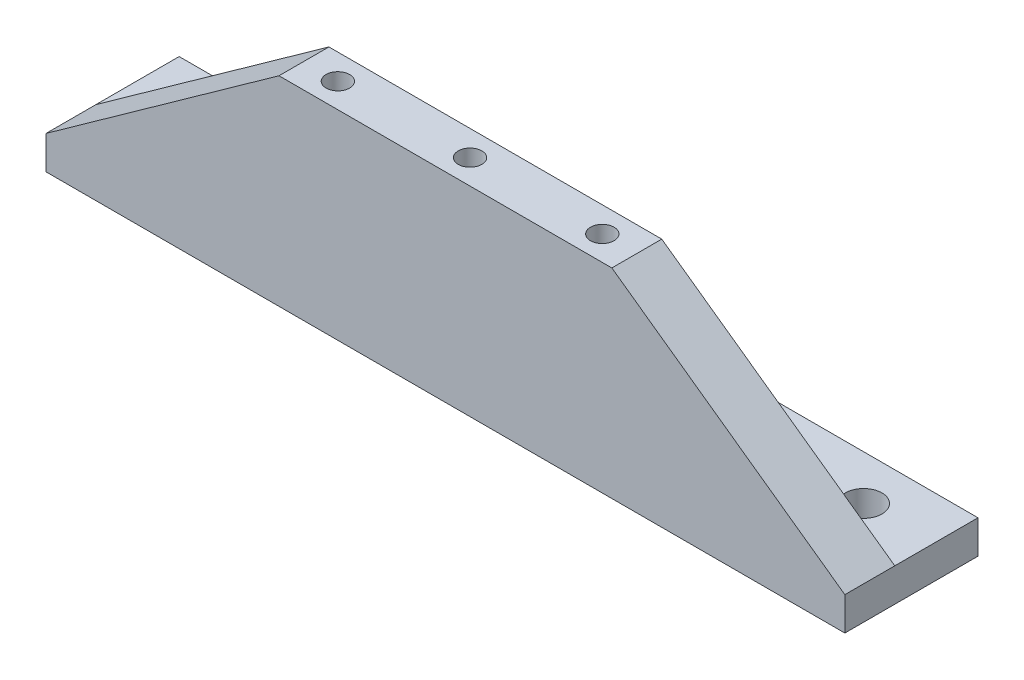
ISO-10303-21;
HEADER;
FILE_DESCRIPTION(('STEP AP214'),'2;1');
FILE_NAME('part.step','',(''),(''),'','','');
FILE_SCHEMA(('AUTOMOTIVE_DESIGN { 1 0 10303 214 1 1 1 1 }'));
ENDSEC;
DATA;
#1=APPLICATION_CONTEXT('core data for automotive mechanical design processes');
#2=APPLICATION_PROTOCOL_DEFINITION('international standard','automotive_design',2000,#1);
#3=PRODUCT_CONTEXT('',#1,'mechanical');
#4=PRODUCT('Part','Part','',(#3));
#5=PRODUCT_RELATED_PRODUCT_CATEGORY('part','',(#4));
#6=PRODUCT_DEFINITION_FORMATION('','',#4);
#7=PRODUCT_DEFINITION_CONTEXT('part definition',#1,'design');
#8=PRODUCT_DEFINITION('design','',#6,#7);
#9=PRODUCT_DEFINITION_SHAPE('','',#8);
#10=(LENGTH_UNIT() NAMED_UNIT(*) SI_UNIT(.MILLI.,.METRE.));
#11=(NAMED_UNIT(*) PLANE_ANGLE_UNIT() SI_UNIT($,.RADIAN.));
#12=(NAMED_UNIT(*) SI_UNIT($,.STERADIAN.) SOLID_ANGLE_UNIT());
#13=UNCERTAINTY_MEASURE_WITH_UNIT(LENGTH_MEASURE(1.E-05),#10,'distance_accuracy_value','');
#14=(GEOMETRIC_REPRESENTATION_CONTEXT(3) GLOBAL_UNCERTAINTY_ASSIGNED_CONTEXT((#13)) GLOBAL_UNIT_ASSIGNED_CONTEXT((#10,
#11,#12)) REPRESENTATION_CONTEXT('',''));
#15=CARTESIAN_POINT('',(0.,0.,0.));
#16=DIRECTION('',(0.,0.,1.));
#17=DIRECTION('',(1.,0.,0.));
#18=AXIS2_PLACEMENT_3D('',#15,#16,#17);
#19=CARTESIAN_POINT('',(0.,38.1,0.));
#20=DIRECTION('',(1.,0.,0.));
#21=DIRECTION('',(0.,0.,-1.));
#22=AXIS2_PLACEMENT_3D('',#19,#20,#21);
#23=PLANE('',#22);
#24=DIRECTION('',(0.,-1.,0.));
#25=VECTOR('',#24,1.);
#26=CARTESIAN_POINT('',(0.,38.1,0.));
#27=LINE('',#26,#25);
#28=CARTESIAN_POINT('',(0.,6.35,0.));
#29=VERTEX_POINT('',#28);
#30=CARTESIAN_POINT('',(0.,0.,0.));
#31=VERTEX_POINT('',#30);
#32=EDGE_CURVE('E24',#29,#31,#27,.T.);
#33=ORIENTED_EDGE('',*,*,#32,.F.);
#34=DIRECTION('',(0.,0.,1.));
#35=VECTOR('',#34,1.);
#36=CARTESIAN_POINT('',(0.,6.35,-25.4));
#37=LINE('',#36,#35);
#38=CARTESIAN_POINT('',(0.,6.35,-9.525));
#39=VERTEX_POINT('',#38);
#40=EDGE_CURVE('E92',#39,#29,#37,.T.);
#41=ORIENTED_EDGE('',*,*,#40,.F.);
#42=CARTESIAN_POINT('',(0.,6.35,-25.4));
#43=VERTEX_POINT('',#42);
#44=EDGE_CURVE('E88',#43,#39,#37,.T.);
#45=ORIENTED_EDGE('',*,*,#44,.F.);
#46=DIRECTION('',(0.,-1.,0.));
#47=VECTOR('',#46,1.);
#48=CARTESIAN_POINT('',(0.,38.1,-25.4));
#49=LINE('',#48,#47);
#50=CARTESIAN_POINT('',(0.,0.,-25.4));
#51=VERTEX_POINT('',#50);
#52=EDGE_CURVE('E39',#43,#51,#49,.T.);
#53=ORIENTED_EDGE('',*,*,#52,.T.);
#54=DIRECTION('',(0.,0.,1.));
#55=VECTOR('',#54,1.);
#56=CARTESIAN_POINT('',(0.,0.,0.));
#57=LINE('',#56,#55);
#58=EDGE_CURVE('E114',#51,#31,#57,.T.);
#59=ORIENTED_EDGE('',*,*,#58,.T.);
#60=EDGE_LOOP('',(#33,#41,#45,#53,#59));
#61=FACE_BOUND('',#60,.T.);
#62=ADVANCED_FACE('F17',(#61),#23,.F.);
#63=CARTESIAN_POINT('',(0.,38.1,0.));
#64=DIRECTION('',(0.,0.,-1.));
#65=DIRECTION('',(-1.,0.,0.));
#66=AXIS2_PLACEMENT_3D('',#63,#64,#65);
#67=PLANE('',#66);
#68=DIRECTION('',(1.,0.,0.));
#69=VECTOR('',#68,1.);
#70=CARTESIAN_POINT('',(0.,38.1,0.));
#71=LINE('',#70,#69);
#72=CARTESIAN_POINT('',(44.45,38.1,0.));
#73=VERTEX_POINT('',#72);
#74=CARTESIAN_POINT('',(107.95,38.1,0.));
#75=VERTEX_POINT('',#74);
#76=EDGE_CURVE('E111',#73,#75,#71,.T.);
#77=ORIENTED_EDGE('',*,*,#76,.F.);
#78=DIRECTION('',(0.813733471206735,0.581238193719097,0.));
#79=VECTOR('',#78,1.);
#80=CARTESIAN_POINT('',(-3.00337837837838,4.20472972972973,0.));
#81=LINE('',#80,#79);
#82=EDGE_CURVE('E98',#29,#73,#81,.T.);
#83=ORIENTED_EDGE('',*,*,#82,.F.);
#84=ORIENTED_EDGE('',*,*,#32,.T.);
#85=DIRECTION('',(1.,0.,0.));
#86=VECTOR('',#85,1.);
#87=CARTESIAN_POINT('',(0.,0.,0.));
#88=LINE('',#87,#86);
#89=CARTESIAN_POINT('',(152.4,0.,0.));
#90=VERTEX_POINT('',#89);
#91=EDGE_CURVE('E116',#31,#90,#88,.T.);
#92=ORIENTED_EDGE('',*,*,#91,.T.);
#93=DIRECTION('',(0.,-1.,0.));
#94=VECTOR('',#93,1.);
#95=CARTESIAN_POINT('',(152.4,38.1,0.));
#96=LINE('',#95,#94);
#97=CARTESIAN_POINT('',(152.4,6.35,0.));
#98=VERTEX_POINT('',#97);
#99=EDGE_CURVE('E126',#98,#90,#96,.T.);
#100=ORIENTED_EDGE('',*,*,#99,.F.);
#101=DIRECTION('',(0.813733471206735,-0.581238193719096,0.));
#102=VECTOR('',#101,1.);
#103=CARTESIAN_POINT('',(54.4898648648649,76.2858108108108,0.));
#104=LINE('',#103,#102);
#105=EDGE_CURVE('E103',#75,#98,#104,.T.);
#106=ORIENTED_EDGE('',*,*,#105,.F.);
#107=EDGE_LOOP('',(#77,#83,#84,#92,#100,#106));
#108=FACE_BOUND('',#107,.T.);
#109=ADVANCED_FACE('F130',(#108),#67,.F.);
#110=CARTESIAN_POINT('',(152.4,38.1,0.));
#111=DIRECTION('',(-1.,0.,0.));
#112=DIRECTION('',(0.,0.,1.));
#113=AXIS2_PLACEMENT_3D('',#110,#111,#112);
#114=PLANE('',#113);
#115=DIRECTION('',(0.,-1.,0.));
#116=VECTOR('',#115,1.);
#117=CARTESIAN_POINT('',(152.4,38.1,-25.4));
#118=LINE('',#117,#116);
#119=CARTESIAN_POINT('',(152.4,6.35,-25.4));
#120=VERTEX_POINT('',#119);
#121=CARTESIAN_POINT('',(152.4,0.,-25.4));
#122=VERTEX_POINT('',#121);
#123=EDGE_CURVE('E124',#120,#122,#118,.T.);
#124=ORIENTED_EDGE('',*,*,#123,.F.);
#125=DIRECTION('',(0.,0.,1.));
#126=VECTOR('',#125,1.);
#127=CARTESIAN_POINT('',(152.4,6.35,-25.4));
#128=LINE('',#127,#126);
#129=CARTESIAN_POINT('',(152.4,6.35,-9.525));
#130=VERTEX_POINT('',#129);
#131=EDGE_CURVE('E99',#120,#130,#128,.T.);
#132=ORIENTED_EDGE('',*,*,#131,.T.);
#133=EDGE_CURVE('E109',#130,#98,#128,.T.);
#134=ORIENTED_EDGE('',*,*,#133,.T.);
#135=ORIENTED_EDGE('',*,*,#99,.T.);
#136=DIRECTION('',(0.,0.,-1.));
#137=VECTOR('',#136,1.);
#138=CARTESIAN_POINT('',(152.4,0.,0.));
#139=LINE('',#138,#137);
#140=EDGE_CURVE('E119',#90,#122,#139,.T.);
#141=ORIENTED_EDGE('',*,*,#140,.T.);
#142=EDGE_LOOP('',(#124,#132,#134,#135,#141));
#143=FACE_BOUND('',#142,.T.);
#144=ADVANCED_FACE('F139',(#143),#114,.F.);
#145=CARTESIAN_POINT('',(0.,38.1,-25.4));
#146=DIRECTION('',(0.,0.,1.));
#147=DIRECTION('',(1.,0.,0.));
#148=AXIS2_PLACEMENT_3D('',#145,#146,#147);
#149=PLANE('',#148);
#150=ORIENTED_EDGE('',*,*,#52,.F.);
#151=DIRECTION('',(1.,0.,0.));
#152=VECTOR('',#151,1.);
#153=CARTESIAN_POINT('',(0.,6.35,-25.4));
#154=LINE('',#153,#152);
#155=EDGE_CURVE('E85',#43,#120,#154,.T.);
#156=ORIENTED_EDGE('',*,*,#155,.T.);
#157=ORIENTED_EDGE('',*,*,#123,.T.);
#158=DIRECTION('',(-1.,0.,0.));
#159=VECTOR('',#158,1.);
#160=CARTESIAN_POINT('',(0.,0.,-25.4));
#161=LINE('',#160,#159);
#162=EDGE_CURVE('E113',#122,#51,#161,.T.);
#163=ORIENTED_EDGE('',*,*,#162,.T.);
#164=EDGE_LOOP('',(#150,#156,#157,#163));
#165=FACE_BOUND('',#164,.T.);
#166=ADVANCED_FACE('F270',(#165),#149,.F.);
#167=CARTESIAN_POINT('',(0.,38.1,0.));
#168=DIRECTION('',(0.,-1.,0.));
#169=DIRECTION('',(0.,0.,-1.));
#170=AXIS2_PLACEMENT_3D('',#167,#168,#169);
#171=PLANE('',#170);
#172=CARTESIAN_POINT('',(101.4222,38.1,-4.699));
#173=DIRECTION('',(0.,-1.,0.));
#174=DIRECTION('',(0.,0.,-1.));
#175=AXIS2_PLACEMENT_3D('',#172,#173,#174);
#176=CIRCLE('',#175,2.2479);
#177=CARTESIAN_POINT('',(101.4222,38.1,-6.9469));
#178=VERTEX_POINT('',#177);
#179=EDGE_CURVE('E209',#178,#178,#176,.T.);
#180=ORIENTED_EDGE('',*,*,#179,.T.);
#181=EDGE_LOOP('',(#180));
#182=FACE_BOUND('',#181,.T.);
#183=CARTESIAN_POINT('',(76.2,38.1,-4.699));
#184=DIRECTION('',(0.,-1.,0.));
#185=DIRECTION('',(0.,0.,-1.));
#186=AXIS2_PLACEMENT_3D('',#183,#184,#185);
#187=CIRCLE('',#186,2.2479);
#188=CARTESIAN_POINT('',(76.2,38.1,-6.9469));
#189=VERTEX_POINT('',#188);
#190=EDGE_CURVE('E197',#189,#189,#187,.T.);
#191=ORIENTED_EDGE('',*,*,#190,.T.);
#192=EDGE_LOOP('',(#191));
#193=FACE_BOUND('',#192,.T.);
#194=CARTESIAN_POINT('',(50.9778,38.1,-4.699));
#195=DIRECTION('',(0.,-1.,0.));
#196=DIRECTION('',(0.,0.,-1.));
#197=AXIS2_PLACEMENT_3D('',#194,#195,#196);
#198=CIRCLE('',#197,2.2479);
#199=CARTESIAN_POINT('',(50.9778,38.1,-6.9469));
#200=VERTEX_POINT('',#199);
#201=EDGE_CURVE('E154',#200,#200,#198,.T.);
#202=ORIENTED_EDGE('',*,*,#201,.T.);
#203=EDGE_LOOP('',(#202));
#204=FACE_BOUND('',#203,.T.);
#205=DIRECTION('',(0.,0.,1.));
#206=VECTOR('',#205,1.);
#207=CARTESIAN_POINT('',(107.95,38.1,-25.4));
#208=LINE('',#207,#206);
#209=CARTESIAN_POINT('',(107.95,38.1,-9.525));
#210=VERTEX_POINT('',#209);
#211=EDGE_CURVE('E106',#210,#75,#208,.T.);
#212=ORIENTED_EDGE('',*,*,#211,.F.);
#213=DIRECTION('',(1.,0.,0.));
#214=VECTOR('',#213,1.);
#215=CARTESIAN_POINT('',(0.,38.1,-9.525));
#216=LINE('',#215,#214);
#217=CARTESIAN_POINT('',(44.45,38.1,-9.525));
#218=VERTEX_POINT('',#217);
#219=EDGE_CURVE('E86',#218,#210,#216,.T.);
#220=ORIENTED_EDGE('',*,*,#219,.F.);
#221=DIRECTION('',(0.,0.,1.));
#222=VECTOR('',#221,1.);
#223=CARTESIAN_POINT('',(44.45,38.1,-25.4));
#224=LINE('',#223,#222);
#225=EDGE_CURVE('E31',#218,#73,#224,.T.);
#226=ORIENTED_EDGE('',*,*,#225,.T.);
#227=ORIENTED_EDGE('',*,*,#76,.T.);
#228=EDGE_LOOP('',(#212,#220,#226,#227));
#229=FACE_BOUND('',#228,.T.);
#230=ADVANCED_FACE('F143',(#182,#193,#204,#229),#171,.F.);
#231=CARTESIAN_POINT('',(0.,0.,0.));
#232=DIRECTION('',(0.,-1.,0.));
#233=DIRECTION('',(0.,0.,-1.));
#234=AXIS2_PLACEMENT_3D('',#231,#232,#233);
#235=PLANE('',#234);
#236=CARTESIAN_POINT('',(101.4222,0.,-4.699));
#237=DIRECTION('',(0.,-1.,0.));
#238=DIRECTION('',(0.,0.,-1.));
#239=AXIS2_PLACEMENT_3D('',#236,#237,#238);
#240=CIRCLE('',#239,3.96875);
#241=CARTESIAN_POINT('',(101.4222,0.,-8.66775));
#242=VERTEX_POINT('',#241);
#243=EDGE_CURVE('E218',#242,#242,#240,.T.);
#244=ORIENTED_EDGE('',*,*,#243,.F.);
#245=EDGE_LOOP('',(#244));
#246=FACE_BOUND('',#245,.T.);
#247=CARTESIAN_POINT('',(76.2,0.,-4.699));
#248=DIRECTION('',(0.,-1.,0.));
#249=DIRECTION('',(0.,0.,-1.));
#250=AXIS2_PLACEMENT_3D('',#247,#248,#249);
#251=CIRCLE('',#250,3.96875);
#252=CARTESIAN_POINT('',(76.2,0.,-8.66775));
#253=VERTEX_POINT('',#252);
#254=EDGE_CURVE('E206',#253,#253,#251,.T.);
#255=ORIENTED_EDGE('',*,*,#254,.F.);
#256=EDGE_LOOP('',(#255));
#257=FACE_BOUND('',#256,.T.);
#258=CARTESIAN_POINT('',(50.9778,0.,-4.699));
#259=DIRECTION('',(0.,-1.,0.));
#260=DIRECTION('',(0.,0.,-1.));
#261=AXIS2_PLACEMENT_3D('',#258,#259,#260);
#262=CIRCLE('',#261,3.96875);
#263=CARTESIAN_POINT('',(50.9778,0.,-8.66775));
#264=VERTEX_POINT('',#263);
#265=EDGE_CURVE('E194',#264,#264,#262,.T.);
#266=ORIENTED_EDGE('',*,*,#265,.F.);
#267=EDGE_LOOP('',(#266));
#268=FACE_BOUND('',#267,.T.);
#269=CARTESIAN_POINT('',(13.2715,0.,-16.8589372808014));
#270=DIRECTION('',(0.,1.,0.));
#271=DIRECTION('',(0.,0.,1.));
#272=AXIS2_PLACEMENT_3D('',#269,#270,#271);
#273=CIRCLE('',#272,3.5433);
#274=CARTESIAN_POINT('',(13.2715,0.,-13.3156372808015));
#275=VERTEX_POINT('',#274);
#276=EDGE_CURVE('E148',#275,#275,#273,.T.);
#277=ORIENTED_EDGE('',*,*,#276,.T.);
#278=EDGE_LOOP('',(#277));
#279=FACE_BOUND('',#278,.T.);
#280=CARTESIAN_POINT('',(63.6905,0.,-16.8589372808009));
#281=DIRECTION('',(0.,1.,0.));
#282=DIRECTION('',(0.,0.,1.));
#283=AXIS2_PLACEMENT_3D('',#280,#281,#282);
#284=CIRCLE('',#283,3.4925);
#285=CARTESIAN_POINT('',(63.6905,0.,-13.3664372808009));
#286=VERTEX_POINT('',#285);
#287=EDGE_CURVE('E174',#286,#286,#284,.T.);
#288=ORIENTED_EDGE('',*,*,#287,.T.);
#289=EDGE_LOOP('',(#288));
#290=FACE_BOUND('',#289,.T.);
#291=CARTESIAN_POINT('',(139.1285,0.,-16.8589372808014));
#292=DIRECTION('',(0.,1.,0.));
#293=DIRECTION('',(0.,0.,1.));
#294=AXIS2_PLACEMENT_3D('',#291,#292,#293);
#295=CIRCLE('',#294,3.4925);
#296=CARTESIAN_POINT('',(139.1285,0.,-13.3664372808014));
#297=VERTEX_POINT('',#296);
#298=EDGE_CURVE('E162',#297,#297,#295,.T.);
#299=ORIENTED_EDGE('',*,*,#298,.T.);
#300=EDGE_LOOP('',(#299));
#301=FACE_BOUND('',#300,.T.);
#302=CARTESIAN_POINT('',(88.8365,0.,-16.8589372808011));
#303=DIRECTION('',(0.,1.,0.));
#304=DIRECTION('',(0.,0.,1.));
#305=AXIS2_PLACEMENT_3D('',#302,#303,#304);
#306=CIRCLE('',#305,3.4925);
#307=CARTESIAN_POINT('',(88.8365,0.,-13.3664372808011));
#308=VERTEX_POINT('',#307);
#309=EDGE_CURVE('E161',#308,#308,#306,.T.);
#310=ORIENTED_EDGE('',*,*,#309,.T.);
#311=EDGE_LOOP('',(#310));
#312=FACE_BOUND('',#311,.T.);
#313=CARTESIAN_POINT('',(113.9825,0.,-16.8589372808013));
#314=DIRECTION('',(0.,1.,0.));
#315=DIRECTION('',(0.,0.,1.));
#316=AXIS2_PLACEMENT_3D('',#313,#314,#315);
#317=CIRCLE('',#316,3.4925);
#318=CARTESIAN_POINT('',(113.9825,0.,-13.3664372808013));
#319=VERTEX_POINT('',#318);
#320=EDGE_CURVE('E168',#319,#319,#317,.T.);
#321=ORIENTED_EDGE('',*,*,#320,.T.);
#322=EDGE_LOOP('',(#321));
#323=FACE_BOUND('',#322,.T.);
#324=CARTESIAN_POINT('',(38.5445,0.,-16.8589372808007));
#325=DIRECTION('',(0.,1.,0.));
#326=DIRECTION('',(0.,0.,1.));
#327=AXIS2_PLACEMENT_3D('',#324,#325,#326);
#328=CIRCLE('',#327,3.4925);
#329=CARTESIAN_POINT('',(38.5445,0.,-13.3664372808007));
#330=VERTEX_POINT('',#329);
#331=EDGE_CURVE('E153',#330,#330,#328,.T.);
#332=ORIENTED_EDGE('',*,*,#331,.T.);
#333=EDGE_LOOP('',(#332));
#334=FACE_BOUND('',#333,.T.);
#335=ORIENTED_EDGE('',*,*,#58,.F.);
#336=ORIENTED_EDGE('',*,*,#162,.F.);
#337=ORIENTED_EDGE('',*,*,#140,.F.);
#338=ORIENTED_EDGE('',*,*,#91,.F.);
#339=EDGE_LOOP('',(#335,#336,#337,#338));
#340=FACE_BOUND('',#339,.T.);
#341=ADVANCED_FACE('F135',(#246,#257,#268,#279,#290,#301,#312,#323,#334,#340),#235,.T.);
#342=CARTESIAN_POINT('',(54.4898648648649,76.2858108108108,-25.4));
#343=DIRECTION('',(-0.581238193719096,-0.813733471206735,0.));
#344=DIRECTION('',(0.813733471206735,-0.581238193719096,0.));
#345=AXIS2_PLACEMENT_3D('',#342,#343,#344);
#346=PLANE('',#345);
#347=ORIENTED_EDGE('',*,*,#133,.F.);
#348=DIRECTION('',(-0.813733471206735,0.581238193719096,0.));
#349=VECTOR('',#348,1.);
#350=CARTESIAN_POINT('',(54.4898648648649,76.2858108108108,-9.525));
#351=LINE('',#350,#349);
#352=EDGE_CURVE('E82',#130,#210,#351,.T.);
#353=ORIENTED_EDGE('',*,*,#352,.T.);
#354=ORIENTED_EDGE('',*,*,#211,.T.);
#355=ORIENTED_EDGE('',*,*,#105,.T.);
#356=EDGE_LOOP('',(#347,#353,#354,#355));
#357=FACE_BOUND('',#356,.T.);
#358=ADVANCED_FACE('F144',(#357),#346,.F.);
#359=CARTESIAN_POINT('',(-3.00337837837838,4.20472972972973,-25.4));
#360=DIRECTION('',(0.581238193719096,-0.813733471206735,0.));
#361=DIRECTION('',(0.813733471206735,0.581238193719097,0.));
#362=AXIS2_PLACEMENT_3D('',#359,#360,#361);
#363=PLANE('',#362);
#364=ORIENTED_EDGE('',*,*,#225,.F.);
#365=DIRECTION('',(-0.813733471206735,-0.581238193719097,0.));
#366=VECTOR('',#365,1.);
#367=CARTESIAN_POINT('',(-3.00337837837838,4.20472972972973,-9.525));
#368=LINE('',#367,#366);
#369=EDGE_CURVE('E11',#218,#39,#368,.T.);
#370=ORIENTED_EDGE('',*,*,#369,.T.);
#371=ORIENTED_EDGE('',*,*,#40,.T.);
#372=ORIENTED_EDGE('',*,*,#82,.T.);
#373=EDGE_LOOP('',(#364,#370,#371,#372));
#374=FACE_BOUND('',#373,.T.);
#375=ADVANCED_FACE('F95',(#374),#363,.F.);
#376=CARTESIAN_POINT('',(0.,6.35,-9.525));
#377=DIRECTION('',(0.,0.,1.));
#378=DIRECTION('',(1.,0.,0.));
#379=AXIS2_PLACEMENT_3D('',#376,#377,#378);
#380=PLANE('',#379);
#381=DIRECTION('',(1.,0.,0.));
#382=VECTOR('',#381,1.);
#383=CARTESIAN_POINT('',(0.,6.35,-9.525));
#384=LINE('',#383,#382);
#385=EDGE_CURVE('E78',#39,#130,#384,.T.);
#386=ORIENTED_EDGE('',*,*,#385,.F.);
#387=ORIENTED_EDGE('',*,*,#369,.F.);
#388=ORIENTED_EDGE('',*,*,#219,.T.);
#389=ORIENTED_EDGE('',*,*,#352,.F.);
#390=EDGE_LOOP('',(#386,#387,#388,#389));
#391=FACE_BOUND('',#390,.T.);
#392=ADVANCED_FACE('F80',(#391),#380,.F.);
#393=CARTESIAN_POINT('',(0.,6.35,-25.4));
#394=DIRECTION('',(0.,-1.,0.));
#395=DIRECTION('',(0.,0.,-1.));
#396=AXIS2_PLACEMENT_3D('',#393,#394,#395);
#397=PLANE('',#396);
#398=CARTESIAN_POINT('',(13.2715,6.35,-16.8589372808014));
#399=DIRECTION('',(0.,1.,0.));
#400=DIRECTION('',(0.,0.,1.));
#401=AXIS2_PLACEMENT_3D('',#398,#399,#400);
#402=CIRCLE('',#401,3.5433);
#403=CARTESIAN_POINT('',(13.2715,6.35,-13.3156372808015));
#404=VERTEX_POINT('',#403);
#405=EDGE_CURVE('E171',#404,#404,#402,.T.);
#406=ORIENTED_EDGE('',*,*,#405,.F.);
#407=EDGE_LOOP('',(#406));
#408=FACE_BOUND('',#407,.T.);
#409=CARTESIAN_POINT('',(63.6905,6.35,-16.8589372808009));
#410=DIRECTION('',(0.,1.,0.));
#411=DIRECTION('',(0.,0.,1.));
#412=AXIS2_PLACEMENT_3D('',#409,#410,#411);
#413=CIRCLE('',#412,3.4925);
#414=CARTESIAN_POINT('',(63.6905,6.35,-13.3664372808009));
#415=VERTEX_POINT('',#414);
#416=EDGE_CURVE('E157',#415,#415,#413,.T.);
#417=ORIENTED_EDGE('',*,*,#416,.F.);
#418=EDGE_LOOP('',(#417));
#419=FACE_BOUND('',#418,.T.);
#420=CARTESIAN_POINT('',(139.1285,6.35,-16.8589372808014));
#421=DIRECTION('',(0.,1.,0.));
#422=DIRECTION('',(0.,0.,1.));
#423=AXIS2_PLACEMENT_3D('',#420,#421,#422);
#424=CIRCLE('',#423,3.4925);
#425=CARTESIAN_POINT('',(139.1285,6.35,-13.3664372808014));
#426=VERTEX_POINT('',#425);
#427=EDGE_CURVE('E177',#426,#426,#424,.T.);
#428=ORIENTED_EDGE('',*,*,#427,.F.);
#429=EDGE_LOOP('',(#428));
#430=FACE_BOUND('',#429,.T.);
#431=CARTESIAN_POINT('',(88.8365,6.35,-16.8589372808011));
#432=DIRECTION('',(0.,1.,0.));
#433=DIRECTION('',(0.,0.,1.));
#434=AXIS2_PLACEMENT_3D('',#431,#432,#433);
#435=CIRCLE('',#434,3.4925);
#436=CARTESIAN_POINT('',(88.8365,6.35,-13.3664372808011));
#437=VERTEX_POINT('',#436);
#438=EDGE_CURVE('E158',#437,#437,#435,.T.);
#439=ORIENTED_EDGE('',*,*,#438,.F.);
#440=EDGE_LOOP('',(#439));
#441=FACE_BOUND('',#440,.T.);
#442=CARTESIAN_POINT('',(113.9825,6.35,-16.8589372808013));
#443=DIRECTION('',(0.,1.,0.));
#444=DIRECTION('',(0.,0.,1.));
#445=AXIS2_PLACEMENT_3D('',#442,#443,#444);
#446=CIRCLE('',#445,3.4925);
#447=CARTESIAN_POINT('',(113.9825,6.35,-13.3664372808013));
#448=VERTEX_POINT('',#447);
#449=EDGE_CURVE('E165',#448,#448,#446,.T.);
#450=ORIENTED_EDGE('',*,*,#449,.F.);
#451=EDGE_LOOP('',(#450));
#452=FACE_BOUND('',#451,.T.);
#453=CARTESIAN_POINT('',(38.5445,6.35,-16.8589372808007));
#454=DIRECTION('',(0.,1.,0.));
#455=DIRECTION('',(0.,0.,1.));
#456=AXIS2_PLACEMENT_3D('',#453,#454,#455);
#457=CIRCLE('',#456,3.4925);
#458=CARTESIAN_POINT('',(38.5445,6.35,-13.3664372808007));
#459=VERTEX_POINT('',#458);
#460=EDGE_CURVE('E150',#459,#459,#457,.T.);
#461=ORIENTED_EDGE('',*,*,#460,.F.);
#462=EDGE_LOOP('',(#461));
#463=FACE_BOUND('',#462,.T.);
#464=ORIENTED_EDGE('',*,*,#131,.F.);
#465=ORIENTED_EDGE('',*,*,#155,.F.);
#466=ORIENTED_EDGE('',*,*,#44,.T.);
#467=ORIENTED_EDGE('',*,*,#385,.T.);
#468=EDGE_LOOP('',(#464,#465,#466,#467));
#469=FACE_BOUND('',#468,.T.);
#470=ADVANCED_FACE('F89',(#408,#419,#430,#441,#452,#463,#469),#397,.F.);
#471=CARTESIAN_POINT('',(38.5445,0.,-16.8589372808007));
#472=DIRECTION('',(0.,1.,0.));
#473=DIRECTION('',(0.,0.,1.));
#474=AXIS2_PLACEMENT_3D('',#471,#472,#473);
#475=CYLINDRICAL_SURFACE('',#474,3.4925);
#476=ORIENTED_EDGE('',*,*,#331,.F.);
#477=EDGE_LOOP('',(#476));
#478=FACE_BOUND('',#477,.T.);
#479=ORIENTED_EDGE('',*,*,#460,.T.);
#480=EDGE_LOOP('',(#479));
#481=FACE_BOUND('',#480,.T.);
#482=ADVANCED_FACE('F243',(#478,#481),#475,.F.);
#483=CARTESIAN_POINT('',(113.9825,0.,-16.8589372808013));
#484=DIRECTION('',(0.,1.,0.));
#485=DIRECTION('',(0.,0.,1.));
#486=AXIS2_PLACEMENT_3D('',#483,#484,#485);
#487=CYLINDRICAL_SURFACE('',#486,3.4925);
#488=ORIENTED_EDGE('',*,*,#320,.F.);
#489=EDGE_LOOP('',(#488));
#490=FACE_BOUND('',#489,.T.);
#491=ORIENTED_EDGE('',*,*,#449,.T.);
#492=EDGE_LOOP('',(#491));
#493=FACE_BOUND('',#492,.T.);
#494=ADVANCED_FACE('F246',(#490,#493),#487,.F.);
#495=CARTESIAN_POINT('',(88.8365,0.,-16.8589372808011));
#496=DIRECTION('',(0.,1.,0.));
#497=DIRECTION('',(0.,0.,1.));
#498=AXIS2_PLACEMENT_3D('',#495,#496,#497);
#499=CYLINDRICAL_SURFACE('',#498,3.4925);
#500=ORIENTED_EDGE('',*,*,#309,.F.);
#501=EDGE_LOOP('',(#500));
#502=FACE_BOUND('',#501,.T.);
#503=ORIENTED_EDGE('',*,*,#438,.T.);
#504=EDGE_LOOP('',(#503));
#505=FACE_BOUND('',#504,.T.);
#506=ADVANCED_FACE('F317',(#502,#505),#499,.F.);
#507=CARTESIAN_POINT('',(139.1285,0.,-16.8589372808014));
#508=DIRECTION('',(0.,1.,0.));
#509=DIRECTION('',(0.,0.,1.));
#510=AXIS2_PLACEMENT_3D('',#507,#508,#509);
#511=CYLINDRICAL_SURFACE('',#510,3.4925);
#512=ORIENTED_EDGE('',*,*,#298,.F.);
#513=EDGE_LOOP('',(#512));
#514=FACE_BOUND('',#513,.T.);
#515=ORIENTED_EDGE('',*,*,#427,.T.);
#516=EDGE_LOOP('',(#515));
#517=FACE_BOUND('',#516,.T.);
#518=ADVANCED_FACE('F327',(#514,#517),#511,.F.);
#519=CARTESIAN_POINT('',(63.6905,0.,-16.8589372808009));
#520=DIRECTION('',(0.,1.,0.));
#521=DIRECTION('',(0.,0.,1.));
#522=AXIS2_PLACEMENT_3D('',#519,#520,#521);
#523=CYLINDRICAL_SURFACE('',#522,3.4925);
#524=ORIENTED_EDGE('',*,*,#287,.F.);
#525=EDGE_LOOP('',(#524));
#526=FACE_BOUND('',#525,.T.);
#527=ORIENTED_EDGE('',*,*,#416,.T.);
#528=EDGE_LOOP('',(#527));
#529=FACE_BOUND('',#528,.T.);
#530=ADVANCED_FACE('F337',(#526,#529),#523,.F.);
#531=CARTESIAN_POINT('',(13.2715,0.,-16.8589372808014));
#532=DIRECTION('',(0.,1.,0.));
#533=DIRECTION('',(0.,0.,1.));
#534=AXIS2_PLACEMENT_3D('',#531,#532,#533);
#535=CYLINDRICAL_SURFACE('',#534,3.5433);
#536=ORIENTED_EDGE('',*,*,#276,.F.);
#537=EDGE_LOOP('',(#536));
#538=FACE_BOUND('',#537,.T.);
#539=ORIENTED_EDGE('',*,*,#405,.T.);
#540=EDGE_LOOP('',(#539));
#541=FACE_BOUND('',#540,.T.);
#542=ADVANCED_FACE('F347',(#538,#541),#535,.F.);
#543=CARTESIAN_POINT('',(50.9778,0.,-4.699));
#544=DIRECTION('',(0.,-1.,0.));
#545=DIRECTION('',(0.,0.,-1.));
#546=AXIS2_PLACEMENT_3D('',#543,#544,#545);
#547=CYLINDRICAL_SURFACE('',#546,2.2479);
#548=ORIENTED_EDGE('',*,*,#201,.F.);
#549=EDGE_LOOP('',(#548));
#550=FACE_BOUND('',#549,.T.);
#551=CARTESIAN_POINT('',(50.9778,4.1656,-4.699));
#552=DIRECTION('',(0.,-1.,0.));
#553=DIRECTION('',(0.,0.,-1.));
#554=AXIS2_PLACEMENT_3D('',#551,#552,#553);
#555=CIRCLE('',#554,2.2479);
#556=CARTESIAN_POINT('',(50.9778,4.1656,-6.9469));
#557=VERTEX_POINT('',#556);
#558=EDGE_CURVE('E188',#557,#557,#555,.T.);
#559=ORIENTED_EDGE('',*,*,#558,.T.);
#560=EDGE_LOOP('',(#559));
#561=FACE_BOUND('',#560,.T.);
#562=ADVANCED_FACE('F357',(#550,#561),#547,.F.);
#563=CARTESIAN_POINT('',(53.2257,4.1656,-4.699));
#564=DIRECTION('',(0.,1.,0.));
#565=DIRECTION('',(0.,0.,1.));
#566=AXIS2_PLACEMENT_3D('',#563,#564,#565);
#567=PLANE('',#566);
#568=ORIENTED_EDGE('',*,*,#558,.F.);
#569=EDGE_LOOP('',(#568));
#570=FACE_BOUND('',#569,.T.);
#571=CARTESIAN_POINT('',(50.9778,4.1656,-4.699));
#572=DIRECTION('',(0.,-1.,0.));
#573=DIRECTION('',(0.,0.,-1.));
#574=AXIS2_PLACEMENT_3D('',#571,#572,#573);
#575=CIRCLE('',#574,3.96875);
#576=CARTESIAN_POINT('',(50.9778,4.1656,-8.66775));
#577=VERTEX_POINT('',#576);
#578=EDGE_CURVE('E191',#577,#577,#575,.T.);
#579=ORIENTED_EDGE('',*,*,#578,.T.);
#580=EDGE_LOOP('',(#579));
#581=FACE_BOUND('',#580,.T.);
#582=ADVANCED_FACE('F367',(#570,#581),#567,.F.);
#583=CARTESIAN_POINT('',(50.9778,0.,-4.699));
#584=DIRECTION('',(0.,-1.,0.));
#585=DIRECTION('',(0.,0.,-1.));
#586=AXIS2_PLACEMENT_3D('',#583,#584,#585);
#587=CYLINDRICAL_SURFACE('',#586,3.96875);
#588=ORIENTED_EDGE('',*,*,#578,.F.);
#589=EDGE_LOOP('',(#588));
#590=FACE_BOUND('',#589,.T.);
#591=ORIENTED_EDGE('',*,*,#265,.T.);
#592=EDGE_LOOP('',(#591));
#593=FACE_BOUND('',#592,.T.);
#594=ADVANCED_FACE('F377',(#590,#593),#587,.F.);
#595=CARTESIAN_POINT('',(76.2,0.,-4.699));
#596=DIRECTION('',(0.,-1.,0.));
#597=DIRECTION('',(0.,0.,-1.));
#598=AXIS2_PLACEMENT_3D('',#595,#596,#597);
#599=CYLINDRICAL_SURFACE('',#598,2.2479);
#600=ORIENTED_EDGE('',*,*,#190,.F.);
#601=EDGE_LOOP('',(#600));
#602=FACE_BOUND('',#601,.T.);
#603=CARTESIAN_POINT('',(76.2,4.1656,-4.699));
#604=DIRECTION('',(0.,-1.,0.));
#605=DIRECTION('',(0.,0.,-1.));
#606=AXIS2_PLACEMENT_3D('',#603,#604,#605);
#607=CIRCLE('',#606,2.2479);
#608=CARTESIAN_POINT('',(76.2,4.1656,-6.9469));
#609=VERTEX_POINT('',#608);
#610=EDGE_CURVE('E200',#609,#609,#607,.T.);
#611=ORIENTED_EDGE('',*,*,#610,.T.);
#612=EDGE_LOOP('',(#611));
#613=FACE_BOUND('',#612,.T.);
#614=ADVANCED_FACE('F387',(#602,#613),#599,.F.);
#615=CARTESIAN_POINT('',(78.4479,4.1656,-4.699));
#616=DIRECTION('',(0.,1.,0.));
#617=DIRECTION('',(0.,0.,1.));
#618=AXIS2_PLACEMENT_3D('',#615,#616,#617);
#619=PLANE('',#618);
#620=ORIENTED_EDGE('',*,*,#610,.F.);
#621=EDGE_LOOP('',(#620));
#622=FACE_BOUND('',#621,.T.);
#623=CARTESIAN_POINT('',(76.2,4.1656,-4.699));
#624=DIRECTION('',(0.,-1.,0.));
#625=DIRECTION('',(0.,0.,-1.));
#626=AXIS2_PLACEMENT_3D('',#623,#624,#625);
#627=CIRCLE('',#626,3.96875);
#628=CARTESIAN_POINT('',(76.2,4.1656,-8.66775));
#629=VERTEX_POINT('',#628);
#630=EDGE_CURVE('E203',#629,#629,#627,.T.);
#631=ORIENTED_EDGE('',*,*,#630,.T.);
#632=EDGE_LOOP('',(#631));
#633=FACE_BOUND('',#632,.T.);
#634=ADVANCED_FACE('F397',(#622,#633),#619,.F.);
#635=CARTESIAN_POINT('',(76.2,0.,-4.699));
#636=DIRECTION('',(0.,-1.,0.));
#637=DIRECTION('',(0.,0.,-1.));
#638=AXIS2_PLACEMENT_3D('',#635,#636,#637);
#639=CYLINDRICAL_SURFACE('',#638,3.96875);
#640=ORIENTED_EDGE('',*,*,#630,.F.);
#641=EDGE_LOOP('',(#640));
#642=FACE_BOUND('',#641,.T.);
#643=ORIENTED_EDGE('',*,*,#254,.T.);
#644=EDGE_LOOP('',(#643));
#645=FACE_BOUND('',#644,.T.);
#646=ADVANCED_FACE('F407',(#642,#645),#639,.F.);
#647=CARTESIAN_POINT('',(101.4222,0.,-4.699));
#648=DIRECTION('',(0.,-1.,0.));
#649=DIRECTION('',(0.,0.,-1.));
#650=AXIS2_PLACEMENT_3D('',#647,#648,#649);
#651=CYLINDRICAL_SURFACE('',#650,2.2479);
#652=ORIENTED_EDGE('',*,*,#179,.F.);
#653=EDGE_LOOP('',(#652));
#654=FACE_BOUND('',#653,.T.);
#655=CARTESIAN_POINT('',(101.4222,4.1656,-4.699));
#656=DIRECTION('',(0.,-1.,0.));
#657=DIRECTION('',(0.,0.,-1.));
#658=AXIS2_PLACEMENT_3D('',#655,#656,#657);
#659=CIRCLE('',#658,2.2479);
#660=CARTESIAN_POINT('',(101.4222,4.1656,-6.9469));
#661=VERTEX_POINT('',#660);
#662=EDGE_CURVE('E212',#661,#661,#659,.T.);
#663=ORIENTED_EDGE('',*,*,#662,.T.);
#664=EDGE_LOOP('',(#663));
#665=FACE_BOUND('',#664,.T.);
#666=ADVANCED_FACE('F417',(#654,#665),#651,.F.);
#667=CARTESIAN_POINT('',(103.6701,4.1656,-4.699));
#668=DIRECTION('',(0.,1.,0.));
#669=DIRECTION('',(0.,0.,1.));
#670=AXIS2_PLACEMENT_3D('',#667,#668,#669);
#671=PLANE('',#670);
#672=ORIENTED_EDGE('',*,*,#662,.F.);
#673=EDGE_LOOP('',(#672));
#674=FACE_BOUND('',#673,.T.);
#675=CARTESIAN_POINT('',(101.4222,4.1656,-4.699));
#676=DIRECTION('',(0.,-1.,0.));
#677=DIRECTION('',(0.,0.,-1.));
#678=AXIS2_PLACEMENT_3D('',#675,#676,#677);
#679=CIRCLE('',#678,3.96875);
#680=CARTESIAN_POINT('',(101.4222,4.1656,-8.66775));
#681=VERTEX_POINT('',#680);
#682=EDGE_CURVE('E215',#681,#681,#679,.T.);
#683=ORIENTED_EDGE('',*,*,#682,.T.);
#684=EDGE_LOOP('',(#683));
#685=FACE_BOUND('',#684,.T.);
#686=ADVANCED_FACE('F427',(#674,#685),#671,.F.);
#687=CARTESIAN_POINT('',(101.4222,0.,-4.699));
#688=DIRECTION('',(0.,-1.,0.));
#689=DIRECTION('',(0.,0.,-1.));
#690=AXIS2_PLACEMENT_3D('',#687,#688,#689);
#691=CYLINDRICAL_SURFACE('',#690,3.96875);
#692=ORIENTED_EDGE('',*,*,#682,.F.);
#693=EDGE_LOOP('',(#692));
#694=FACE_BOUND('',#693,.T.);
#695=ORIENTED_EDGE('',*,*,#243,.T.);
#696=EDGE_LOOP('',(#695));
#697=FACE_BOUND('',#696,.T.);
#698=ADVANCED_FACE('F222',(#694,#697),#691,.F.);
#699=CLOSED_SHELL('',(#62,#109,#144,#166,#230,#341,#358,#375,#392,#470,#482,#494,#506,#518,#530,
#542,#562,#582,#594,#614,#634,#646,#666,#686,#698));
#700=MANIFOLD_SOLID_BREP('B1',#699);
#701=ADVANCED_BREP_SHAPE_REPRESENTATION('',(#18,#700),#14);
#702=SHAPE_DEFINITION_REPRESENTATION(#9,#701);
ENDSEC;
END-ISO-10303-21;
